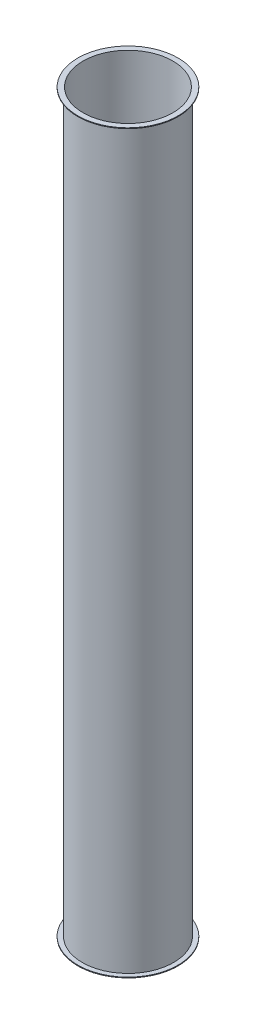
ISO-10303-21;
HEADER;
FILE_DESCRIPTION(('STEP AP214'),'2;1');
FILE_NAME('part.step','',(''),(''),'','','');
FILE_SCHEMA(('AUTOMOTIVE_DESIGN { 1 0 10303 214 1 1 1 1 }'));
ENDSEC;
DATA;
#1=APPLICATION_CONTEXT('core data for automotive mechanical design processes');
#2=APPLICATION_PROTOCOL_DEFINITION('international standard','automotive_design',2000,#1);
#3=PRODUCT_CONTEXT('',#1,'mechanical');
#4=PRODUCT('Part','Part','',(#3));
#5=PRODUCT_RELATED_PRODUCT_CATEGORY('part','',(#4));
#6=PRODUCT_DEFINITION_FORMATION('','',#4);
#7=PRODUCT_DEFINITION_CONTEXT('part definition',#1,'design');
#8=PRODUCT_DEFINITION('design','',#6,#7);
#9=PRODUCT_DEFINITION_SHAPE('','',#8);
#10=(LENGTH_UNIT() NAMED_UNIT(*) SI_UNIT(.MILLI.,.METRE.));
#11=(NAMED_UNIT(*) PLANE_ANGLE_UNIT() SI_UNIT($,.RADIAN.));
#12=(NAMED_UNIT(*) SI_UNIT($,.STERADIAN.) SOLID_ANGLE_UNIT());
#13=UNCERTAINTY_MEASURE_WITH_UNIT(LENGTH_MEASURE(1.E-05),#10,'distance_accuracy_value','');
#14=(GEOMETRIC_REPRESENTATION_CONTEXT(3) GLOBAL_UNCERTAINTY_ASSIGNED_CONTEXT((#13)) GLOBAL_UNIT_ASSIGNED_CONTEXT((#10,
#11,#12)) REPRESENTATION_CONTEXT('',''));
#15=CARTESIAN_POINT('',(0.,0.,0.));
#16=DIRECTION('',(0.,0.,1.));
#17=DIRECTION('',(1.,0.,0.));
#18=AXIS2_PLACEMENT_3D('',#15,#16,#17);
#19=CARTESIAN_POINT('',(-63.5,984.,0.));
#20=DIRECTION('',(0.,1.,0.));
#21=DIRECTION('',(1.,0.,0.));
#22=AXIS2_PLACEMENT_3D('',#19,#20,#21);
#23=PLANE('',#22);
#24=CARTESIAN_POINT('',(0.,984.,0.));
#25=DIRECTION('',(0.,1.,0.));
#26=DIRECTION('',(-1.,0.,0.));
#27=AXIS2_PLACEMENT_3D('',#24,#25,#26);
#28=CIRCLE('',#27,60.);
#29=CARTESIAN_POINT('',(-60.,984.,0.));
#30=VERTEX_POINT('',#29);
#31=EDGE_CURVE('E81',#30,#30,#28,.T.);
#32=ORIENTED_EDGE('',*,*,#31,.F.);
#33=EDGE_LOOP('',(#32));
#34=FACE_BOUND('',#33,.T.);
#35=CARTESIAN_POINT('',(0.,984.,0.));
#36=DIRECTION('',(0.,1.,0.));
#37=DIRECTION('',(-1.,0.,0.));
#38=AXIS2_PLACEMENT_3D('',#35,#36,#37);
#39=CIRCLE('',#38,67.);
#40=CARTESIAN_POINT('',(-67.,984.,0.));
#41=VERTEX_POINT('',#40);
#42=EDGE_CURVE('E10',#41,#41,#39,.T.);
#43=ORIENTED_EDGE('',*,*,#42,.T.);
#44=EDGE_LOOP('',(#43));
#45=FACE_BOUND('',#44,.T.);
#46=ADVANCED_FACE('F16',(#34,#45),#23,.T.);
#47=CARTESIAN_POINT('',(0.,983.5,0.));
#48=DIRECTION('',(0.,1.,0.));
#49=DIRECTION('',(-1.,0.,0.));
#50=AXIS2_PLACEMENT_3D('',#47,#48,#49);
#51=CYLINDRICAL_SURFACE('',#50,67.);
#52=CARTESIAN_POINT('',(0.,983.,0.));
#53=DIRECTION('',(0.,1.,0.));
#54=DIRECTION('',(-1.,0.,0.));
#55=AXIS2_PLACEMENT_3D('',#52,#53,#54);
#56=CIRCLE('',#55,67.);
#57=CARTESIAN_POINT('',(-67.,983.,0.));
#58=VERTEX_POINT('',#57);
#59=EDGE_CURVE('E19',#58,#58,#56,.T.);
#60=ORIENTED_EDGE('',*,*,#59,.T.);
#61=EDGE_LOOP('',(#60));
#62=FACE_BOUND('',#61,.T.);
#63=ORIENTED_EDGE('',*,*,#42,.F.);
#64=EDGE_LOOP('',(#63));
#65=FACE_BOUND('',#64,.T.);
#66=ADVANCED_FACE('F113',(#62,#65),#51,.T.);
#67=CARTESIAN_POINT('',(-64.,983.,0.));
#68=DIRECTION('',(0.,-1.,0.));
#69=DIRECTION('',(0.,0.,-1.));
#70=AXIS2_PLACEMENT_3D('',#67,#68,#69);
#71=PLANE('',#70);
#72=CARTESIAN_POINT('',(0.,983.,0.));
#73=DIRECTION('',(0.,1.,0.));
#74=DIRECTION('',(-1.,0.,0.));
#75=AXIS2_PLACEMENT_3D('',#72,#73,#74);
#76=CIRCLE('',#75,61.);
#77=CARTESIAN_POINT('',(-61.,983.,0.));
#78=VERTEX_POINT('',#77);
#79=EDGE_CURVE('E66',#78,#78,#76,.T.);
#80=ORIENTED_EDGE('',*,*,#79,.T.);
#81=EDGE_LOOP('',(#80));
#82=FACE_BOUND('',#81,.T.);
#83=ORIENTED_EDGE('',*,*,#59,.F.);
#84=EDGE_LOOP('',(#83));
#85=FACE_BOUND('',#84,.T.);
#86=ADVANCED_FACE('F67',(#82,#85),#71,.T.);
#87=CARTESIAN_POINT('',(0.,492.,0.));
#88=DIRECTION('',(0.,1.,0.));
#89=DIRECTION('',(-1.,0.,0.));
#90=AXIS2_PLACEMENT_3D('',#87,#88,#89);
#91=CYLINDRICAL_SURFACE('',#90,61.);
#92=CARTESIAN_POINT('',(0.,0.999999999999943,0.));
#93=DIRECTION('',(0.,1.,0.));
#94=DIRECTION('',(-1.,0.,0.));
#95=AXIS2_PLACEMENT_3D('',#92,#93,#94);
#96=CIRCLE('',#95,61.);
#97=CARTESIAN_POINT('',(-61.,0.999999999999937,0.));
#98=VERTEX_POINT('',#97);
#99=EDGE_CURVE('E60',#98,#98,#96,.T.);
#100=ORIENTED_EDGE('',*,*,#99,.T.);
#101=EDGE_LOOP('',(#100));
#102=FACE_BOUND('',#101,.T.);
#103=ORIENTED_EDGE('',*,*,#79,.F.);
#104=EDGE_LOOP('',(#103));
#105=FACE_BOUND('',#104,.T.);
#106=ADVANCED_FACE('F125',(#102,#105),#91,.T.);
#107=CARTESIAN_POINT('',(-64.,0.999999999999936,0.));
#108=DIRECTION('',(0.,1.,0.));
#109=DIRECTION('',(1.,0.,0.));
#110=AXIS2_PLACEMENT_3D('',#107,#108,#109);
#111=PLANE('',#110);
#112=ORIENTED_EDGE('',*,*,#99,.F.);
#113=EDGE_LOOP('',(#112));
#114=FACE_BOUND('',#113,.T.);
#115=CARTESIAN_POINT('',(0.,0.999999999999943,0.));
#116=DIRECTION('',(0.,1.,0.));
#117=DIRECTION('',(-1.,0.,0.));
#118=AXIS2_PLACEMENT_3D('',#115,#116,#117);
#119=CIRCLE('',#118,67.);
#120=CARTESIAN_POINT('',(-67.,0.999999999999936,0.));
#121=VERTEX_POINT('',#120);
#122=EDGE_CURVE('E77',#121,#121,#119,.T.);
#123=ORIENTED_EDGE('',*,*,#122,.T.);
#124=EDGE_LOOP('',(#123));
#125=FACE_BOUND('',#124,.T.);
#126=ADVANCED_FACE('F108',(#114,#125),#111,.T.);
#127=CARTESIAN_POINT('',(0.,0.499999999999972,0.));
#128=DIRECTION('',(0.,1.,0.));
#129=DIRECTION('',(-1.,0.,0.));
#130=AXIS2_PLACEMENT_3D('',#127,#128,#129);
#131=CYLINDRICAL_SURFACE('',#130,67.);
#132=CARTESIAN_POINT('',(0.,0.,0.));
#133=DIRECTION('',(0.,1.,0.));
#134=DIRECTION('',(-1.,0.,0.));
#135=AXIS2_PLACEMENT_3D('',#132,#133,#134);
#136=CIRCLE('',#135,67.);
#137=CARTESIAN_POINT('',(-67.,0.,0.));
#138=VERTEX_POINT('',#137);
#139=EDGE_CURVE('E85',#138,#138,#136,.T.);
#140=ORIENTED_EDGE('',*,*,#139,.T.);
#141=EDGE_LOOP('',(#140));
#142=FACE_BOUND('',#141,.T.);
#143=ORIENTED_EDGE('',*,*,#122,.F.);
#144=EDGE_LOOP('',(#143));
#145=FACE_BOUND('',#144,.T.);
#146=ADVANCED_FACE('F93',(#142,#145),#131,.T.);
#147=CARTESIAN_POINT('',(-63.5,0.,0.));
#148=DIRECTION('',(0.,-1.,0.));
#149=DIRECTION('',(0.,0.,-1.));
#150=AXIS2_PLACEMENT_3D('',#147,#148,#149);
#151=PLANE('',#150);
#152=CARTESIAN_POINT('',(0.,0.,0.));
#153=DIRECTION('',(0.,1.,0.));
#154=DIRECTION('',(-1.,0.,0.));
#155=AXIS2_PLACEMENT_3D('',#152,#153,#154);
#156=CIRCLE('',#155,60.);
#157=CARTESIAN_POINT('',(-60.,0.,0.));
#158=VERTEX_POINT('',#157);
#159=EDGE_CURVE('E79',#158,#158,#156,.T.);
#160=ORIENTED_EDGE('',*,*,#159,.T.);
#161=EDGE_LOOP('',(#160));
#162=FACE_BOUND('',#161,.T.);
#163=ORIENTED_EDGE('',*,*,#139,.F.);
#164=EDGE_LOOP('',(#163));
#165=FACE_BOUND('',#164,.T.);
#166=ADVANCED_FACE('F96',(#162,#165),#151,.T.);
#167=CARTESIAN_POINT('',(0.,492.,0.));
#168=DIRECTION('',(0.,1.,0.));
#169=DIRECTION('',(-1.,0.,0.));
#170=AXIS2_PLACEMENT_3D('',#167,#168,#169);
#171=CYLINDRICAL_SURFACE('',#170,60.);
#172=ORIENTED_EDGE('',*,*,#31,.T.);
#173=EDGE_LOOP('',(#172));
#174=FACE_BOUND('',#173,.T.);
#175=ORIENTED_EDGE('',*,*,#159,.F.);
#176=EDGE_LOOP('',(#175));
#177=FACE_BOUND('',#176,.T.);
#178=ADVANCED_FACE('F98',(#174,#177),#171,.F.);
#179=CLOSED_SHELL('',(#46,#66,#86,#106,#126,#146,#166,#178));
#180=MANIFOLD_SOLID_BREP('B1',#179);
#181=ADVANCED_BREP_SHAPE_REPRESENTATION('',(#18,#180),#14);
#182=SHAPE_DEFINITION_REPRESENTATION(#9,#181);
ENDSEC;
END-ISO-10303-21;
